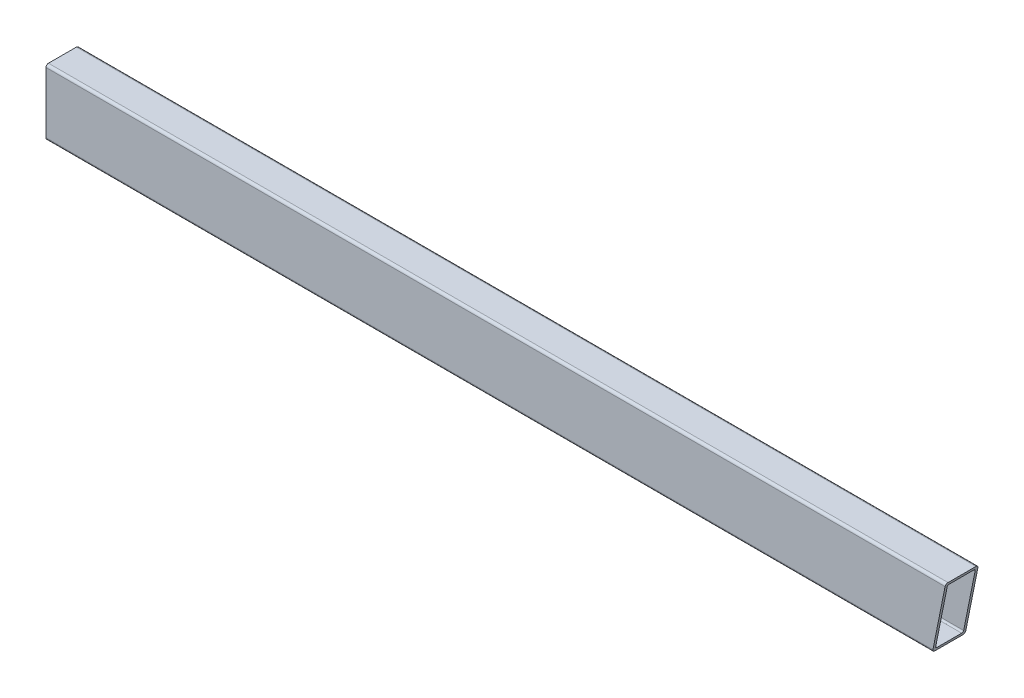
ISO-10303-21;
HEADER;
FILE_DESCRIPTION(('STEP AP214'),'2;1');
FILE_NAME('part.step','',(''),(''),'','','');
FILE_SCHEMA(('AUTOMOTIVE_DESIGN { 1 0 10303 214 1 1 1 1 }'));
ENDSEC;
DATA;
#1=APPLICATION_CONTEXT('core data for automotive mechanical design processes');
#2=APPLICATION_PROTOCOL_DEFINITION('international standard','automotive_design',2000,#1);
#3=PRODUCT_CONTEXT('',#1,'mechanical');
#4=PRODUCT('Part','Part','',(#3));
#5=PRODUCT_RELATED_PRODUCT_CATEGORY('part','',(#4));
#6=PRODUCT_DEFINITION_FORMATION('','',#4);
#7=PRODUCT_DEFINITION_CONTEXT('part definition',#1,'design');
#8=PRODUCT_DEFINITION('design','',#6,#7);
#9=PRODUCT_DEFINITION_SHAPE('','',#8);
#10=(LENGTH_UNIT() NAMED_UNIT(*) SI_UNIT(.MILLI.,.METRE.));
#11=(NAMED_UNIT(*) PLANE_ANGLE_UNIT() SI_UNIT($,.RADIAN.));
#12=(NAMED_UNIT(*) SI_UNIT($,.STERADIAN.) SOLID_ANGLE_UNIT());
#13=UNCERTAINTY_MEASURE_WITH_UNIT(LENGTH_MEASURE(1.E-05),#10,'distance_accuracy_value','');
#14=(GEOMETRIC_REPRESENTATION_CONTEXT(3) GLOBAL_UNCERTAINTY_ASSIGNED_CONTEXT((#13)) GLOBAL_UNIT_ASSIGNED_CONTEXT((#10,
#11,#12)) REPRESENTATION_CONTEXT('',''));
#15=CARTESIAN_POINT('',(0.,0.,0.));
#16=DIRECTION('',(0.,0.,1.));
#17=DIRECTION('',(1.,0.,0.));
#18=AXIS2_PLACEMENT_3D('',#15,#16,#17);
#19=CARTESIAN_POINT('',(588.372032168238,38.5,-10.));
#20=DIRECTION('',(0.,0.,1.));
#21=DIRECTION('',(0.,-1.,0.));
#22=AXIS2_PLACEMENT_3D('',#19,#20,#21);
#23=PLANE('',#22);
#24=DIRECTION('',(0.196116135138184,0.98058067569092,0.));
#25=VECTOR('',#24,1.);
#26=CARTESIAN_POINT('',(548.502620363449,46.4738823609578,-10.));
#27=LINE('',#26,#25);
#28=CARTESIAN_POINT('',(539.507843891257,1.50000000000004,-10.));
#29=VERTEX_POINT('',#28);
#30=CARTESIAN_POINT('',(546.907843891257,38.5,-10.));
#31=VERTEX_POINT('',#30);
#32=EDGE_CURVE('E306',#29,#31,#27,.T.);
#33=ORIENTED_EDGE('',*,*,#32,.F.);
#34=DIRECTION('',(-1.,0.,0.));
#35=VECTOR('',#34,1.);
#36=CARTESIAN_POINT('',(588.372032168238,1.50000000000004,-10.));
#37=LINE('',#36,#35);
#38=CARTESIAN_POINT('',(0.,1.50000000000004,-10.));
#39=VERTEX_POINT('',#38);
#40=EDGE_CURVE('E50',#29,#39,#37,.T.);
#41=ORIENTED_EDGE('',*,*,#40,.T.);
#42=DIRECTION('',(0.,1.,0.));
#43=VECTOR('',#42,1.);
#44=CARTESIAN_POINT('',(0.,38.5,-10.));
#45=LINE('',#44,#43);
#46=CARTESIAN_POINT('',(0.,38.5,-10.));
#47=VERTEX_POINT('',#46);
#48=EDGE_CURVE('E201',#39,#47,#45,.T.);
#49=ORIENTED_EDGE('',*,*,#48,.T.);
#50=DIRECTION('',(-1.,0.,0.));
#51=VECTOR('',#50,1.);
#52=CARTESIAN_POINT('',(588.372032168238,38.5,-10.));
#53=LINE('',#52,#51);
#54=EDGE_CURVE('E204',#31,#47,#53,.T.);
#55=ORIENTED_EDGE('',*,*,#54,.F.);
#56=EDGE_LOOP('',(#33,#41,#49,#55));
#57=FACE_BOUND('',#56,.T.);
#58=ADVANCED_FACE('F35',(#57),#23,.F.);
#59=CARTESIAN_POINT('',(588.372032168238,1.50000000000004,-8.5));
#60=DIRECTION('',(-1.,0.,0.));
#61=DIRECTION('',(0.,0.,1.));
#62=AXIS2_PLACEMENT_3D('',#59,#60,#61);
#63=CYLINDRICAL_SURFACE('',#62,1.50000000000001);
#64=CARTESIAN_POINT('',(539.507843891257,1.50000000000004,-8.5));
#65=DIRECTION('',(0.98058067569092,-0.196116135138184,0.));
#66=DIRECTION('',(-0.196116135138184,-0.98058067569092,0.));
#67=AXIS2_PLACEMENT_3D('',#64,#65,#66);
#68=ELLIPSE('',#67,1.52970585407784,1.50000000000001);
#69=CARTESIAN_POINT('',(539.207843891258,0.,-8.49999999999998));
#70=VERTEX_POINT('',#69);
#71=EDGE_CURVE('E242',#70,#29,#68,.T.);
#72=ORIENTED_EDGE('',*,*,#71,.F.);
#73=DIRECTION('',(-1.,0.,0.));
#74=VECTOR('',#73,1.);
#75=CARTESIAN_POINT('',(588.372032168238,0.,-8.49999999999998));
#76=LINE('',#75,#74);
#77=CARTESIAN_POINT('',(0.,0.,-8.49999999999998));
#78=VERTEX_POINT('',#77);
#79=EDGE_CURVE('E207',#70,#78,#76,.T.);
#80=ORIENTED_EDGE('',*,*,#79,.T.);
#81=CARTESIAN_POINT('',(0.,1.50000000000004,-8.5));
#82=DIRECTION('',(1.,0.,0.));
#83=DIRECTION('',(0.,0.,1.));
#84=AXIS2_PLACEMENT_3D('',#81,#82,#83);
#85=CIRCLE('',#84,1.50000000000001);
#86=EDGE_CURVE('E199',#78,#39,#85,.T.);
#87=ORIENTED_EDGE('',*,*,#86,.T.);
#88=ORIENTED_EDGE('',*,*,#40,.F.);
#89=EDGE_LOOP('',(#72,#80,#87,#88));
#90=FACE_BOUND('',#89,.T.);
#91=ADVANCED_FACE('F239',(#90),#63,.T.);
#92=CARTESIAN_POINT('',(588.372032168238,0.,8.5));
#93=DIRECTION('',(0.,1.,0.));
#94=DIRECTION('',(0.,0.,1.));
#95=AXIS2_PLACEMENT_3D('',#92,#93,#94);
#96=PLANE('',#95);
#97=DIRECTION('',(0.,0.,-1.));
#98=VECTOR('',#97,1.);
#99=CARTESIAN_POINT('',(539.207843891257,0.,8.50000000000001));
#100=LINE('',#99,#98);
#101=CARTESIAN_POINT('',(539.207843891257,0.,8.5));
#102=VERTEX_POINT('',#101);
#103=EDGE_CURVE('E247',#102,#70,#100,.T.);
#104=ORIENTED_EDGE('',*,*,#103,.F.);
#105=DIRECTION('',(-1.,0.,0.));
#106=VECTOR('',#105,1.);
#107=CARTESIAN_POINT('',(588.372032168238,0.,8.5));
#108=LINE('',#107,#106);
#109=CARTESIAN_POINT('',(0.,0.,8.5));
#110=VERTEX_POINT('',#109);
#111=EDGE_CURVE('E209',#102,#110,#108,.T.);
#112=ORIENTED_EDGE('',*,*,#111,.T.);
#113=DIRECTION('',(0.,0.,-1.));
#114=VECTOR('',#113,1.);
#115=CARTESIAN_POINT('',(0.,0.,8.5));
#116=LINE('',#115,#114);
#117=EDGE_CURVE('E196',#110,#78,#116,.T.);
#118=ORIENTED_EDGE('',*,*,#117,.T.);
#119=ORIENTED_EDGE('',*,*,#79,.F.);
#120=EDGE_LOOP('',(#104,#112,#118,#119));
#121=FACE_BOUND('',#120,.T.);
#122=ADVANCED_FACE('F245',(#121),#96,.F.);
#123=CARTESIAN_POINT('',(588.372032168238,1.50000000000006,8.5));
#124=DIRECTION('',(-1.,0.,0.));
#125=DIRECTION('',(0.,0.,1.));
#126=AXIS2_PLACEMENT_3D('',#123,#124,#125);
#127=CYLINDRICAL_SURFACE('',#126,1.50000000000001);
#128=CARTESIAN_POINT('',(539.507843891257,1.50000000000006,8.5));
#129=DIRECTION('',(0.98058067569092,-0.196116135138184,0.));
#130=DIRECTION('',(-0.196116135138184,-0.98058067569092,0.));
#131=AXIS2_PLACEMENT_3D('',#128,#129,#130);
#132=ELLIPSE('',#131,1.52970585407784,1.50000000000001);
#133=CARTESIAN_POINT('',(539.507843891257,1.50000000000006,10.));
#134=VERTEX_POINT('',#133);
#135=EDGE_CURVE('E310',#134,#102,#132,.T.);
#136=ORIENTED_EDGE('',*,*,#135,.F.);
#137=DIRECTION('',(-1.,0.,0.));
#138=VECTOR('',#137,1.);
#139=CARTESIAN_POINT('',(588.372032168238,1.50000000000006,10.));
#140=LINE('',#139,#138);
#141=CARTESIAN_POINT('',(0.,1.50000000000006,10.));
#142=VERTEX_POINT('',#141);
#143=EDGE_CURVE('E211',#134,#142,#140,.T.);
#144=ORIENTED_EDGE('',*,*,#143,.T.);
#145=CARTESIAN_POINT('',(0.,1.50000000000006,8.5));
#146=DIRECTION('',(1.,0.,0.));
#147=DIRECTION('',(0.,0.,-1.));
#148=AXIS2_PLACEMENT_3D('',#145,#146,#147);
#149=CIRCLE('',#148,1.50000000000001);
#150=EDGE_CURVE('E193',#142,#110,#149,.T.);
#151=ORIENTED_EDGE('',*,*,#150,.T.);
#152=ORIENTED_EDGE('',*,*,#111,.F.);
#153=EDGE_LOOP('',(#136,#144,#151,#152));
#154=FACE_BOUND('',#153,.T.);
#155=ADVANCED_FACE('F250',(#154),#127,.T.);
#156=CARTESIAN_POINT('',(588.372032168238,38.5,10.));
#157=DIRECTION('',(0.,0.,-1.));
#158=DIRECTION('',(0.,1.,0.));
#159=AXIS2_PLACEMENT_3D('',#156,#157,#158);
#160=PLANE('',#159);
#161=DIRECTION('',(-0.196116135138184,-0.98058067569092,0.));
#162=VECTOR('',#161,1.);
#163=CARTESIAN_POINT('',(548.502620363449,46.4738823609579,10.));
#164=LINE('',#163,#162);
#165=CARTESIAN_POINT('',(546.907843891257,38.5,10.));
#166=VERTEX_POINT('',#165);
#167=EDGE_CURVE('E256',#166,#134,#164,.T.);
#168=ORIENTED_EDGE('',*,*,#167,.F.);
#169=DIRECTION('',(-1.,0.,0.));
#170=VECTOR('',#169,1.);
#171=CARTESIAN_POINT('',(588.372032168238,38.5,10.));
#172=LINE('',#171,#170);
#173=CARTESIAN_POINT('',(0.,38.5,10.));
#174=VERTEX_POINT('',#173);
#175=EDGE_CURVE('E213',#166,#174,#172,.T.);
#176=ORIENTED_EDGE('',*,*,#175,.T.);
#177=DIRECTION('',(0.,-1.,0.));
#178=VECTOR('',#177,1.);
#179=CARTESIAN_POINT('',(0.,38.5,10.));
#180=LINE('',#179,#178);
#181=EDGE_CURVE('E190',#174,#142,#180,.T.);
#182=ORIENTED_EDGE('',*,*,#181,.T.);
#183=ORIENTED_EDGE('',*,*,#143,.F.);
#184=EDGE_LOOP('',(#168,#176,#182,#183));
#185=FACE_BOUND('',#184,.T.);
#186=ADVANCED_FACE('F253',(#185),#160,.F.);
#187=CARTESIAN_POINT('',(588.372032168238,38.5,8.49999999999999));
#188=DIRECTION('',(-1.,0.,0.));
#189=DIRECTION('',(0.,0.,1.));
#190=AXIS2_PLACEMENT_3D('',#187,#188,#189);
#191=CYLINDRICAL_SURFACE('',#190,1.50000000000001);
#192=CARTESIAN_POINT('',(546.907843891257,38.5,8.49999999999999));
#193=DIRECTION('',(0.98058067569092,-0.196116135138184,0.));
#194=DIRECTION('',(-0.196116135138184,-0.98058067569092,0.));
#195=AXIS2_PLACEMENT_3D('',#192,#193,#194);
#196=ELLIPSE('',#195,1.52970585407784,1.50000000000001);
#197=CARTESIAN_POINT('',(547.207843891257,40.0000000000001,8.49999999999999));
#198=VERTEX_POINT('',#197);
#199=EDGE_CURVE('E260',#198,#166,#196,.T.);
#200=ORIENTED_EDGE('',*,*,#199,.F.);
#201=DIRECTION('',(-1.,0.,0.));
#202=VECTOR('',#201,1.);
#203=CARTESIAN_POINT('',(588.372032168238,40.0000000000001,8.49999999999999));
#204=LINE('',#203,#202);
#205=CARTESIAN_POINT('',(0.,40.0000000000001,8.49999999999999));
#206=VERTEX_POINT('',#205);
#207=EDGE_CURVE('E215',#198,#206,#204,.T.);
#208=ORIENTED_EDGE('',*,*,#207,.T.);
#209=CARTESIAN_POINT('',(0.,38.5,8.49999999999999));
#210=DIRECTION('',(1.,0.,0.));
#211=DIRECTION('',(0.,0.,1.));
#212=AXIS2_PLACEMENT_3D('',#209,#210,#211);
#213=CIRCLE('',#212,1.50000000000001);
#214=EDGE_CURVE('E187',#206,#174,#213,.T.);
#215=ORIENTED_EDGE('',*,*,#214,.T.);
#216=ORIENTED_EDGE('',*,*,#175,.F.);
#217=EDGE_LOOP('',(#200,#208,#215,#216));
#218=FACE_BOUND('',#217,.T.);
#219=ADVANCED_FACE('F259',(#218),#191,.T.);
#220=CARTESIAN_POINT('',(588.372032168238,40.0000000000001,8.49999999999999));
#221=DIRECTION('',(0.,-1.,0.));
#222=DIRECTION('',(0.,0.,-1.));
#223=AXIS2_PLACEMENT_3D('',#220,#221,#222);
#224=PLANE('',#223);
#225=DIRECTION('',(0.,0.,1.));
#226=VECTOR('',#225,1.);
#227=CARTESIAN_POINT('',(547.207843891257,40.0000000000001,8.49999999999999));
#228=LINE('',#227,#226);
#229=CARTESIAN_POINT('',(547.207843891257,40.,-8.49999999999999));
#230=VERTEX_POINT('',#229);
#231=EDGE_CURVE('E223',#230,#198,#228,.T.);
#232=ORIENTED_EDGE('',*,*,#231,.F.);
#233=DIRECTION('',(-1.,0.,0.));
#234=VECTOR('',#233,1.);
#235=CARTESIAN_POINT('',(588.372032168238,40.,-8.49999999999999));
#236=LINE('',#235,#234);
#237=CARTESIAN_POINT('',(0.,40.,-8.49999999999999));
#238=VERTEX_POINT('',#237);
#239=EDGE_CURVE('E43',#230,#238,#236,.T.);
#240=ORIENTED_EDGE('',*,*,#239,.T.);
#241=DIRECTION('',(0.,0.,1.));
#242=VECTOR('',#241,1.);
#243=CARTESIAN_POINT('',(0.,40.0000000000001,8.49999999999999));
#244=LINE('',#243,#242);
#245=EDGE_CURVE('E184',#238,#206,#244,.T.);
#246=ORIENTED_EDGE('',*,*,#245,.T.);
#247=ORIENTED_EDGE('',*,*,#207,.F.);
#248=EDGE_LOOP('',(#232,#240,#246,#247));
#249=FACE_BOUND('',#248,.T.);
#250=ADVANCED_FACE('F219',(#249),#224,.F.);
#251=CARTESIAN_POINT('',(588.372032168238,38.5,-8.50000000000001));
#252=DIRECTION('',(-1.,0.,0.));
#253=DIRECTION('',(0.,0.,1.));
#254=AXIS2_PLACEMENT_3D('',#251,#252,#253);
#255=CYLINDRICAL_SURFACE('',#254,1.5);
#256=CARTESIAN_POINT('',(546.907843891257,38.5,-8.50000000000001));
#257=DIRECTION('',(0.98058067569092,-0.196116135138184,0.));
#258=DIRECTION('',(-0.196116135138184,-0.98058067569092,0.));
#259=AXIS2_PLACEMENT_3D('',#256,#257,#258);
#260=ELLIPSE('',#259,1.52970585407784,1.5);
#261=EDGE_CURVE('E233',#31,#230,#260,.T.);
#262=ORIENTED_EDGE('',*,*,#261,.F.);
#263=ORIENTED_EDGE('',*,*,#54,.T.);
#264=CARTESIAN_POINT('',(0.,38.5,-8.50000000000001));
#265=DIRECTION('',(1.,0.,0.));
#266=DIRECTION('',(0.,0.,1.));
#267=AXIS2_PLACEMENT_3D('',#264,#265,#266);
#268=CIRCLE('',#267,1.5);
#269=EDGE_CURVE('E181',#47,#238,#268,.T.);
#270=ORIENTED_EDGE('',*,*,#269,.T.);
#271=ORIENTED_EDGE('',*,*,#239,.F.);
#272=EDGE_LOOP('',(#262,#263,#270,#271));
#273=FACE_BOUND('',#272,.T.);
#274=ADVANCED_FACE('F37',(#273),#255,.T.);
#275=CARTESIAN_POINT('',(0.,38.5,-8.50000000000001));
#276=DIRECTION('',(-1.,0.,0.));
#277=DIRECTION('',(0.,0.,1.));
#278=AXIS2_PLACEMENT_3D('',#275,#276,#277);
#279=PLANE('',#278);
#280=ORIENTED_EDGE('',*,*,#269,.F.);
#281=ORIENTED_EDGE('',*,*,#48,.F.);
#282=ORIENTED_EDGE('',*,*,#86,.F.);
#283=ORIENTED_EDGE('',*,*,#117,.F.);
#284=ORIENTED_EDGE('',*,*,#150,.F.);
#285=ORIENTED_EDGE('',*,*,#181,.F.);
#286=ORIENTED_EDGE('',*,*,#214,.F.);
#287=ORIENTED_EDGE('',*,*,#245,.F.);
#288=EDGE_LOOP('',(#280,#281,#282,#283,#284,#285,#286,#287));
#289=FACE_BOUND('',#288,.T.);
#290=DIRECTION('',(0.,0.,-1.));
#291=VECTOR('',#290,1.);
#292=CARTESIAN_POINT('',(0.,1.50000000000006,7.5));
#293=LINE('',#292,#291);
#294=CARTESIAN_POINT('',(0.,1.50000000000006,7.5));
#295=VERTEX_POINT('',#294);
#296=CARTESIAN_POINT('',(0.,1.50000000000006,-7.5));
#297=VERTEX_POINT('',#296);
#298=EDGE_CURVE('E163',#295,#297,#293,.T.);
#299=ORIENTED_EDGE('',*,*,#298,.T.);
#300=CARTESIAN_POINT('',(0.,2.50000000000004,-7.5));
#301=DIRECTION('',(1.,0.,0.));
#302=DIRECTION('',(0.,0.,1.));
#303=AXIS2_PLACEMENT_3D('',#300,#301,#302);
#304=CIRCLE('',#303,0.999999999999994);
#305=CARTESIAN_POINT('',(0.,2.50000000000004,-8.5));
#306=VERTEX_POINT('',#305);
#307=EDGE_CURVE('E262',#297,#306,#304,.T.);
#308=ORIENTED_EDGE('',*,*,#307,.T.);
#309=DIRECTION('',(0.,1.,0.));
#310=VECTOR('',#309,1.);
#311=CARTESIAN_POINT('',(0.,37.5,-8.50000000000001));
#312=LINE('',#311,#310);
#313=CARTESIAN_POINT('',(0.,37.5,-8.50000000000001));
#314=VERTEX_POINT('',#313);
#315=EDGE_CURVE('E269',#306,#314,#312,.T.);
#316=ORIENTED_EDGE('',*,*,#315,.T.);
#317=CARTESIAN_POINT('',(0.,37.5,-7.50000000000001));
#318=DIRECTION('',(1.,0.,0.));
#319=DIRECTION('',(0.,0.,1.));
#320=AXIS2_PLACEMENT_3D('',#317,#318,#319);
#321=CIRCLE('',#320,1.);
#322=CARTESIAN_POINT('',(0.,38.5,-7.50000000000001));
#323=VERTEX_POINT('',#322);
#324=EDGE_CURVE('E272',#314,#323,#321,.T.);
#325=ORIENTED_EDGE('',*,*,#324,.T.);
#326=DIRECTION('',(0.,0.,1.));
#327=VECTOR('',#326,1.);
#328=CARTESIAN_POINT('',(0.,38.5,7.49999999999999));
#329=LINE('',#328,#327);
#330=CARTESIAN_POINT('',(0.,38.5,7.49999999999999));
#331=VERTEX_POINT('',#330);
#332=EDGE_CURVE('E275',#323,#331,#329,.T.);
#333=ORIENTED_EDGE('',*,*,#332,.T.);
#334=CARTESIAN_POINT('',(0.,37.5,7.49999999999999));
#335=DIRECTION('',(1.,0.,0.));
#336=DIRECTION('',(0.,0.,1.));
#337=AXIS2_PLACEMENT_3D('',#334,#335,#336);
#338=CIRCLE('',#337,1.);
#339=CARTESIAN_POINT('',(0.,37.5,8.49999999999999));
#340=VERTEX_POINT('',#339);
#341=EDGE_CURVE('E278',#331,#340,#338,.T.);
#342=ORIENTED_EDGE('',*,*,#341,.T.);
#343=DIRECTION('',(0.,-1.,0.));
#344=VECTOR('',#343,1.);
#345=CARTESIAN_POINT('',(0.,37.5,8.49999999999999));
#346=LINE('',#345,#344);
#347=CARTESIAN_POINT('',(0.,2.50000000000006,8.5));
#348=VERTEX_POINT('',#347);
#349=EDGE_CURVE('E281',#340,#348,#346,.T.);
#350=ORIENTED_EDGE('',*,*,#349,.T.);
#351=CARTESIAN_POINT('',(0.,2.50000000000006,7.5));
#352=DIRECTION('',(1.,0.,0.));
#353=DIRECTION('',(0.,0.,-1.));
#354=AXIS2_PLACEMENT_3D('',#351,#352,#353);
#355=CIRCLE('',#354,0.999999999999999);
#356=EDGE_CURVE('E284',#348,#295,#355,.T.);
#357=ORIENTED_EDGE('',*,*,#356,.T.);
#358=EDGE_LOOP('',(#299,#308,#316,#325,#333,#342,#350,#357));
#359=FACE_BOUND('',#358,.T.);
#360=ADVANCED_FACE('F229',(#289,#359),#279,.T.);
#361=CARTESIAN_POINT('',(588.372032168238,1.50000000000006,7.5));
#362=DIRECTION('',(0.,1.,0.));
#363=DIRECTION('',(0.,0.,1.));
#364=AXIS2_PLACEMENT_3D('',#361,#362,#363);
#365=PLANE('',#364);
#366=DIRECTION('',(-1.,0.,0.));
#367=VECTOR('',#366,1.);
#368=CARTESIAN_POINT('',(588.372032168238,1.50000000000006,7.5));
#369=LINE('',#368,#367);
#370=CARTESIAN_POINT('',(539.507843891257,1.50000000000006,7.5));
#371=VERTEX_POINT('',#370);
#372=EDGE_CURVE('E155',#371,#295,#369,.T.);
#373=ORIENTED_EDGE('',*,*,#372,.F.);
#374=DIRECTION('',(0.,0.,-1.));
#375=VECTOR('',#374,1.);
#376=CARTESIAN_POINT('',(539.507843891257,1.50000000000006,7.5));
#377=LINE('',#376,#375);
#378=CARTESIAN_POINT('',(539.507843891257,1.50000000000006,-7.5));
#379=VERTEX_POINT('',#378);
#380=EDGE_CURVE('E11',#371,#379,#377,.T.);
#381=ORIENTED_EDGE('',*,*,#380,.T.);
#382=DIRECTION('',(-1.,0.,0.));
#383=VECTOR('',#382,1.);
#384=CARTESIAN_POINT('',(588.372032168238,1.50000000000006,-7.5));
#385=LINE('',#384,#383);
#386=EDGE_CURVE('E165',#379,#297,#385,.T.);
#387=ORIENTED_EDGE('',*,*,#386,.T.);
#388=ORIENTED_EDGE('',*,*,#298,.F.);
#389=EDGE_LOOP('',(#373,#381,#387,#388));
#390=FACE_BOUND('',#389,.T.);
#391=ADVANCED_FACE('F161',(#390),#365,.T.);
#392=CARTESIAN_POINT('',(588.372032168238,2.50000000000006,7.5));
#393=DIRECTION('',(-1.,0.,0.));
#394=DIRECTION('',(0.,0.,1.));
#395=AXIS2_PLACEMENT_3D('',#392,#393,#394);
#396=CYLINDRICAL_SURFACE('',#395,0.999999999999999);
#397=DIRECTION('',(-1.,0.,0.));
#398=VECTOR('',#397,1.);
#399=CARTESIAN_POINT('',(588.372032168238,2.50000000000006,8.5));
#400=LINE('',#399,#398);
#401=CARTESIAN_POINT('',(539.707843891257,2.50000000000006,8.5));
#402=VERTEX_POINT('',#401);
#403=EDGE_CURVE('E157',#402,#348,#400,.T.);
#404=ORIENTED_EDGE('',*,*,#403,.F.);
#405=CARTESIAN_POINT('',(539.707843891257,2.50000000000006,7.5));
#406=DIRECTION('',(0.98058067569092,-0.196116135138184,0.));
#407=DIRECTION('',(-0.196116135138184,-0.98058067569092,0.));
#408=AXIS2_PLACEMENT_3D('',#405,#406,#407);
#409=ELLIPSE('',#408,1.01980390271856,0.999999999999999);
#410=EDGE_CURVE('E148',#402,#371,#409,.T.);
#411=ORIENTED_EDGE('',*,*,#410,.T.);
#412=ORIENTED_EDGE('',*,*,#372,.T.);
#413=ORIENTED_EDGE('',*,*,#356,.F.);
#414=EDGE_LOOP('',(#404,#411,#412,#413));
#415=FACE_BOUND('',#414,.T.);
#416=ADVANCED_FACE('F153',(#415),#396,.F.);
#417=CARTESIAN_POINT('',(588.372032168238,37.5,8.49999999999999));
#418=DIRECTION('',(0.,0.,-1.));
#419=DIRECTION('',(0.,1.,0.));
#420=AXIS2_PLACEMENT_3D('',#417,#418,#419);
#421=PLANE('',#420);
#422=DIRECTION('',(-1.,0.,0.));
#423=VECTOR('',#422,1.);
#424=CARTESIAN_POINT('',(588.372032168238,37.5,8.49999999999999));
#425=LINE('',#424,#423);
#426=CARTESIAN_POINT('',(546.707843891257,37.5,8.49999999999999));
#427=VERTEX_POINT('',#426);
#428=EDGE_CURVE('E167',#427,#340,#425,.T.);
#429=ORIENTED_EDGE('',*,*,#428,.F.);
#430=DIRECTION('',(-0.196116135138184,-0.98058067569092,0.));
#431=VECTOR('',#430,1.);
#432=CARTESIAN_POINT('',(548.310312671141,45.5123438994194,8.49999999999999));
#433=LINE('',#432,#431);
#434=EDGE_CURVE('E159',#427,#402,#433,.T.);
#435=ORIENTED_EDGE('',*,*,#434,.T.);
#436=ORIENTED_EDGE('',*,*,#403,.T.);
#437=ORIENTED_EDGE('',*,*,#349,.F.);
#438=EDGE_LOOP('',(#429,#435,#436,#437));
#439=FACE_BOUND('',#438,.T.);
#440=ADVANCED_FACE('F290',(#439),#421,.T.);
#441=CARTESIAN_POINT('',(588.372032168238,37.5,7.49999999999999));
#442=DIRECTION('',(-1.,0.,0.));
#443=DIRECTION('',(0.,0.,1.));
#444=AXIS2_PLACEMENT_3D('',#441,#442,#443);
#445=CYLINDRICAL_SURFACE('',#444,1.);
#446=DIRECTION('',(-1.,0.,0.));
#447=VECTOR('',#446,1.);
#448=CARTESIAN_POINT('',(588.372032168238,38.5,7.49999999999999));
#449=LINE('',#448,#447);
#450=CARTESIAN_POINT('',(546.907843891257,38.5,7.49999999999999));
#451=VERTEX_POINT('',#450);
#452=EDGE_CURVE('E173',#451,#331,#449,.T.);
#453=ORIENTED_EDGE('',*,*,#452,.F.);
#454=CARTESIAN_POINT('',(546.707843891258,37.5,7.49999999999999));
#455=DIRECTION('',(0.98058067569092,-0.196116135138184,0.));
#456=DIRECTION('',(-0.196116135138184,-0.98058067569092,0.));
#457=AXIS2_PLACEMENT_3D('',#454,#455,#456);
#458=ELLIPSE('',#457,1.01980390271856,1.);
#459=EDGE_CURVE('E292',#451,#427,#458,.T.);
#460=ORIENTED_EDGE('',*,*,#459,.T.);
#461=ORIENTED_EDGE('',*,*,#428,.T.);
#462=ORIENTED_EDGE('',*,*,#341,.F.);
#463=EDGE_LOOP('',(#453,#460,#461,#462));
#464=FACE_BOUND('',#463,.T.);
#465=ADVANCED_FACE('F327',(#464),#445,.F.);
#466=CARTESIAN_POINT('',(588.372032168238,38.5,7.49999999999999));
#467=DIRECTION('',(0.,-1.,0.));
#468=DIRECTION('',(0.,0.,-1.));
#469=AXIS2_PLACEMENT_3D('',#466,#467,#468);
#470=PLANE('',#469);
#471=DIRECTION('',(-1.,0.,0.));
#472=VECTOR('',#471,1.);
#473=CARTESIAN_POINT('',(588.372032168238,38.5,-7.50000000000001));
#474=LINE('',#473,#472);
#475=CARTESIAN_POINT('',(546.907843891257,38.5,-7.50000000000001));
#476=VERTEX_POINT('',#475);
#477=EDGE_CURVE('E175',#476,#323,#474,.T.);
#478=ORIENTED_EDGE('',*,*,#477,.F.);
#479=DIRECTION('',(0.,0.,1.));
#480=VECTOR('',#479,1.);
#481=CARTESIAN_POINT('',(546.907843891257,38.5,7.49999999999999));
#482=LINE('',#481,#480);
#483=EDGE_CURVE('E294',#476,#451,#482,.T.);
#484=ORIENTED_EDGE('',*,*,#483,.T.);
#485=ORIENTED_EDGE('',*,*,#452,.T.);
#486=ORIENTED_EDGE('',*,*,#332,.F.);
#487=EDGE_LOOP('',(#478,#484,#485,#486));
#488=FACE_BOUND('',#487,.T.);
#489=ADVANCED_FACE('F324',(#488),#470,.T.);
#490=CARTESIAN_POINT('',(588.372032168238,37.5,-7.50000000000001));
#491=DIRECTION('',(-1.,0.,0.));
#492=DIRECTION('',(0.,0.,1.));
#493=AXIS2_PLACEMENT_3D('',#490,#491,#492);
#494=CYLINDRICAL_SURFACE('',#493,1.);
#495=DIRECTION('',(-1.,0.,0.));
#496=VECTOR('',#495,1.);
#497=CARTESIAN_POINT('',(588.372032168238,37.5,-8.50000000000001));
#498=LINE('',#497,#496);
#499=CARTESIAN_POINT('',(546.707843891258,37.5,-8.50000000000001));
#500=VERTEX_POINT('',#499);
#501=EDGE_CURVE('E177',#500,#314,#498,.T.);
#502=ORIENTED_EDGE('',*,*,#501,.F.);
#503=CARTESIAN_POINT('',(546.707843891258,37.5,-7.50000000000001));
#504=DIRECTION('',(0.98058067569092,-0.196116135138184,0.));
#505=DIRECTION('',(-0.196116135138184,-0.98058067569092,0.));
#506=AXIS2_PLACEMENT_3D('',#503,#504,#505);
#507=ELLIPSE('',#506,1.01980390271856,1.);
#508=EDGE_CURVE('E299',#500,#476,#507,.T.);
#509=ORIENTED_EDGE('',*,*,#508,.T.);
#510=ORIENTED_EDGE('',*,*,#477,.T.);
#511=ORIENTED_EDGE('',*,*,#324,.F.);
#512=EDGE_LOOP('',(#502,#509,#510,#511));
#513=FACE_BOUND('',#512,.T.);
#514=ADVANCED_FACE('F321',(#513),#494,.F.);
#515=CARTESIAN_POINT('',(588.372032168238,37.5,-8.50000000000001));
#516=DIRECTION('',(0.,0.,1.));
#517=DIRECTION('',(0.,-1.,0.));
#518=AXIS2_PLACEMENT_3D('',#515,#516,#517);
#519=PLANE('',#518);
#520=DIRECTION('',(-1.,0.,0.));
#521=VECTOR('',#520,1.);
#522=CARTESIAN_POINT('',(588.372032168238,2.50000000000004,-8.5));
#523=LINE('',#522,#521);
#524=CARTESIAN_POINT('',(539.707843891257,2.50000000000004,-8.5));
#525=VERTEX_POINT('',#524);
#526=EDGE_CURVE('E179',#525,#306,#523,.T.);
#527=ORIENTED_EDGE('',*,*,#526,.F.);
#528=DIRECTION('',(0.196116135138184,0.98058067569092,0.));
#529=VECTOR('',#528,1.);
#530=CARTESIAN_POINT('',(548.310312671141,45.5123438994194,-8.50000000000001));
#531=LINE('',#530,#529);
#532=EDGE_CURVE('E302',#525,#500,#531,.T.);
#533=ORIENTED_EDGE('',*,*,#532,.T.);
#534=ORIENTED_EDGE('',*,*,#501,.T.);
#535=ORIENTED_EDGE('',*,*,#315,.F.);
#536=EDGE_LOOP('',(#527,#533,#534,#535));
#537=FACE_BOUND('',#536,.T.);
#538=ADVANCED_FACE('F316',(#537),#519,.T.);
#539=CARTESIAN_POINT('',(588.372032168238,2.50000000000004,-7.5));
#540=DIRECTION('',(-1.,0.,0.));
#541=DIRECTION('',(0.,0.,1.));
#542=AXIS2_PLACEMENT_3D('',#539,#540,#541);
#543=CYLINDRICAL_SURFACE('',#542,0.999999999999994);
#544=ORIENTED_EDGE('',*,*,#386,.F.);
#545=CARTESIAN_POINT('',(539.707843891257,2.50000000000004,-7.5));
#546=DIRECTION('',(0.98058067569092,-0.196116135138184,0.));
#547=DIRECTION('',(-0.196116135138184,-0.98058067569092,0.));
#548=AXIS2_PLACEMENT_3D('',#545,#546,#547);
#549=ELLIPSE('',#548,1.01980390271855,0.999999999999994);
#550=EDGE_CURVE('E58',#379,#525,#549,.T.);
#551=ORIENTED_EDGE('',*,*,#550,.T.);
#552=ORIENTED_EDGE('',*,*,#526,.T.);
#553=ORIENTED_EDGE('',*,*,#307,.F.);
#554=EDGE_LOOP('',(#544,#551,#552,#553));
#555=FACE_BOUND('',#554,.T.);
#556=ADVANCED_FACE('F312',(#555),#543,.F.);
#557=CARTESIAN_POINT('',(940.776772972363,2007.84464540553,-8.50000000000007));
#558=DIRECTION('',(0.98058067569092,-0.196116135138184,0.));
#559=DIRECTION('',(0.,0.,-1.));
#560=AXIS2_PLACEMENT_3D('',#557,#558,#559);
#561=PLANE('',#560);
#562=ORIENTED_EDGE('',*,*,#550,.F.);
#563=ORIENTED_EDGE('',*,*,#380,.F.);
#564=ORIENTED_EDGE('',*,*,#410,.F.);
#565=ORIENTED_EDGE('',*,*,#434,.F.);
#566=ORIENTED_EDGE('',*,*,#459,.F.);
#567=ORIENTED_EDGE('',*,*,#483,.F.);
#568=ORIENTED_EDGE('',*,*,#508,.F.);
#569=ORIENTED_EDGE('',*,*,#532,.F.);
#570=EDGE_LOOP('',(#562,#563,#564,#565,#566,#567,#568,#569));
#571=FACE_BOUND('',#570,.T.);
#572=ORIENTED_EDGE('',*,*,#32,.T.);
#573=ORIENTED_EDGE('',*,*,#261,.T.);
#574=ORIENTED_EDGE('',*,*,#231,.T.);
#575=ORIENTED_EDGE('',*,*,#199,.T.);
#576=ORIENTED_EDGE('',*,*,#167,.T.);
#577=ORIENTED_EDGE('',*,*,#135,.T.);
#578=ORIENTED_EDGE('',*,*,#103,.T.);
#579=ORIENTED_EDGE('',*,*,#71,.T.);
#580=EDGE_LOOP('',(#572,#573,#574,#575,#576,#577,#578,#579));
#581=FACE_BOUND('',#580,.T.);
#582=ADVANCED_FACE('F146',(#571,#581),#561,.T.);
#583=CLOSED_SHELL('',(#58,#91,#122,#155,#186,#219,#250,#274,#360,#391,#416,#440,#465,#489,#514,
#538,#556,#582));
#584=MANIFOLD_SOLID_BREP('B2',#583);
#585=ADVANCED_BREP_SHAPE_REPRESENTATION('',(#18,#584),#14);
#586=SHAPE_DEFINITION_REPRESENTATION(#9,#585);
ENDSEC;
END-ISO-10303-21;
